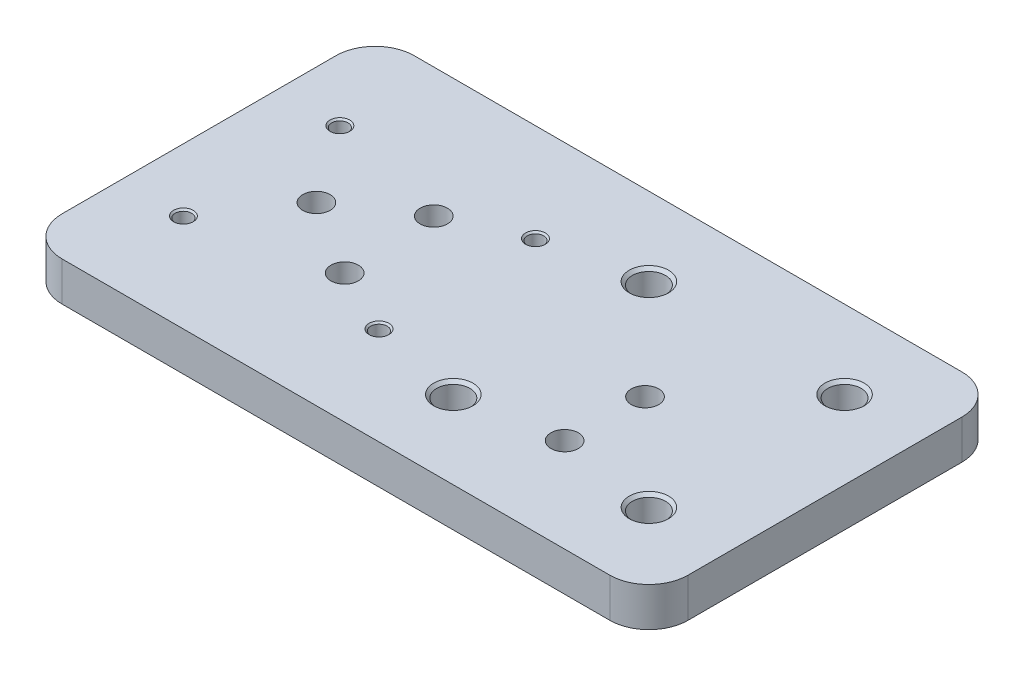
ISO-10303-21;
HEADER;
FILE_DESCRIPTION(('STEP AP214'),'2;1');
FILE_NAME('part.step','',(''),(''),'','','');
FILE_SCHEMA(('AUTOMOTIVE_DESIGN { 1 0 10303 214 1 1 1 1 }'));
ENDSEC;
DATA;
#1=APPLICATION_CONTEXT('core data for automotive mechanical design processes');
#2=APPLICATION_PROTOCOL_DEFINITION('international standard','automotive_design',2000,#1);
#3=PRODUCT_CONTEXT('',#1,'mechanical');
#4=PRODUCT('Part','Part','',(#3));
#5=PRODUCT_RELATED_PRODUCT_CATEGORY('part','',(#4));
#6=PRODUCT_DEFINITION_FORMATION('','',#4);
#7=PRODUCT_DEFINITION_CONTEXT('part definition',#1,'design');
#8=PRODUCT_DEFINITION('design','',#6,#7);
#9=PRODUCT_DEFINITION_SHAPE('','',#8);
#10=(LENGTH_UNIT() NAMED_UNIT(*) SI_UNIT(.MILLI.,.METRE.));
#11=(NAMED_UNIT(*) PLANE_ANGLE_UNIT() SI_UNIT($,.RADIAN.));
#12=(NAMED_UNIT(*) SI_UNIT($,.STERADIAN.) SOLID_ANGLE_UNIT());
#13=UNCERTAINTY_MEASURE_WITH_UNIT(LENGTH_MEASURE(1.E-05),#10,'distance_accuracy_value','');
#14=(GEOMETRIC_REPRESENTATION_CONTEXT(3) GLOBAL_UNCERTAINTY_ASSIGNED_CONTEXT((#13)) GLOBAL_UNIT_ASSIGNED_CONTEXT((#10,
#11,#12)) REPRESENTATION_CONTEXT('',''));
#15=CARTESIAN_POINT('',(0.,0.,0.));
#16=DIRECTION('',(0.,0.,1.));
#17=DIRECTION('',(1.,0.,0.));
#18=AXIS2_PLACEMENT_3D('',#15,#16,#17);
#19=CARTESIAN_POINT('',(150.,10.,10.));
#20=DIRECTION('',(0.,-1.,0.));
#21=DIRECTION('',(0.,0.,-1.));
#22=AXIS2_PLACEMENT_3D('',#19,#20,#21);
#23=PLANE('',#22);
#24=CARTESIAN_POINT('',(48.,10.,33.));
#25=DIRECTION('',(0.,-1.,0.));
#26=DIRECTION('',(0.,0.,-1.));
#27=AXIS2_PLACEMENT_3D('',#24,#25,#26);
#28=CIRCLE('',#27,3.5);
#29=CARTESIAN_POINT('',(48.,10.,29.5));
#30=VERTEX_POINT('',#29);
#31=EDGE_CURVE('E260',#30,#30,#28,.T.);
#32=ORIENTED_EDGE('',*,*,#31,.T.);
#33=EDGE_LOOP('',(#32));
#34=FACE_BOUND('',#33,.T.);
#35=CARTESIAN_POINT('',(30.,10.,45.));
#36=DIRECTION('',(0.,-1.,0.));
#37=DIRECTION('',(0.,0.,-1.));
#38=AXIS2_PLACEMENT_3D('',#35,#36,#37);
#39=CIRCLE('',#38,3.5);
#40=CARTESIAN_POINT('',(30.,10.,41.5));
#41=VERTEX_POINT('',#40);
#42=EDGE_CURVE('E263',#41,#41,#39,.T.);
#43=ORIENTED_EDGE('',*,*,#42,.T.);
#44=EDGE_LOOP('',(#43));
#45=FACE_BOUND('',#44,.T.);
#46=CARTESIAN_POINT('',(49.2273002760498,10.,57.));
#47=DIRECTION('',(0.,-1.,0.));
#48=DIRECTION('',(0.,0.,-1.));
#49=AXIS2_PLACEMENT_3D('',#46,#47,#48);
#50=CIRCLE('',#49,3.5);
#51=CARTESIAN_POINT('',(49.2273002760498,10.,53.5));
#52=VERTEX_POINT('',#51);
#53=EDGE_CURVE('E266',#52,#52,#50,.T.);
#54=ORIENTED_EDGE('',*,*,#53,.T.);
#55=EDGE_LOOP('',(#54));
#56=FACE_BOUND('',#55,.T.);
#57=CARTESIAN_POINT('',(114.452044256162,10.,66.));
#58=DIRECTION('',(0.,-1.,0.));
#59=DIRECTION('',(0.,0.,-1.));
#60=AXIS2_PLACEMENT_3D('',#57,#58,#59);
#61=CIRCLE('',#60,3.50000000000001);
#62=CARTESIAN_POINT('',(114.452044256162,10.,62.5));
#63=VERTEX_POINT('',#62);
#64=EDGE_CURVE('E269',#63,#63,#61,.T.);
#65=ORIENTED_EDGE('',*,*,#64,.T.);
#66=EDGE_LOOP('',(#65));
#67=FACE_BOUND('',#66,.T.);
#68=CARTESIAN_POINT('',(115.,10.,46.));
#69=DIRECTION('',(0.,-1.,0.));
#70=DIRECTION('',(0.,0.,-1.));
#71=AXIS2_PLACEMENT_3D('',#68,#69,#70);
#72=CIRCLE('',#71,3.50000000000001);
#73=CARTESIAN_POINT('',(115.,10.,42.5));
#74=VERTEX_POINT('',#73);
#75=EDGE_CURVE('E272',#74,#74,#72,.T.);
#76=ORIENTED_EDGE('',*,*,#75,.T.);
#77=EDGE_LOOP('',(#76));
#78=FACE_BOUND('',#77,.T.);
#79=CARTESIAN_POINT('',(140.,10.,20.));
#80=DIRECTION('',(0.,1.,0.));
#81=DIRECTION('',(0.,0.,1.));
#82=AXIS2_PLACEMENT_3D('',#79,#80,#81);
#83=CIRCLE('',#82,5.025);
#84=CARTESIAN_POINT('',(140.,10.,25.025));
#85=VERTEX_POINT('',#84);
#86=EDGE_CURVE('E248',#85,#85,#83,.T.);
#87=ORIENTED_EDGE('',*,*,#86,.F.);
#88=EDGE_LOOP('',(#87));
#89=FACE_BOUND('',#88,.T.);
#90=CARTESIAN_POINT('',(140.,10.,70.));
#91=DIRECTION('',(0.,1.,0.));
#92=DIRECTION('',(0.,0.,1.));
#93=AXIS2_PLACEMENT_3D('',#90,#91,#92);
#94=CIRCLE('',#93,5.025);
#95=CARTESIAN_POINT('',(140.,10.,75.025));
#96=VERTEX_POINT('',#95);
#97=EDGE_CURVE('E239',#96,#96,#94,.T.);
#98=ORIENTED_EDGE('',*,*,#97,.F.);
#99=EDGE_LOOP('',(#98));
#100=FACE_BOUND('',#99,.T.);
#101=CARTESIAN_POINT('',(16.,10.,25.));
#102=DIRECTION('',(0.,1.,0.));
#103=DIRECTION('',(0.,0.,1.));
#104=AXIS2_PLACEMENT_3D('',#101,#102,#103);
#105=CIRCLE('',#104,2.525);
#106=CARTESIAN_POINT('',(16.,10.,27.525));
#107=VERTEX_POINT('',#106);
#108=EDGE_CURVE('E221',#107,#107,#105,.T.);
#109=ORIENTED_EDGE('',*,*,#108,.F.);
#110=EDGE_LOOP('',(#109));
#111=FACE_BOUND('',#110,.T.);
#112=CARTESIAN_POINT('',(16.,10.,65.));
#113=DIRECTION('',(0.,1.,0.));
#114=DIRECTION('',(0.,0.,1.));
#115=AXIS2_PLACEMENT_3D('',#112,#113,#114);
#116=CIRCLE('',#115,2.525);
#117=CARTESIAN_POINT('',(16.,10.,67.525));
#118=VERTEX_POINT('',#117);
#119=EDGE_CURVE('E212',#118,#118,#116,.T.);
#120=ORIENTED_EDGE('',*,*,#119,.F.);
#121=EDGE_LOOP('',(#120));
#122=FACE_BOUND('',#121,.T.);
#123=CARTESIAN_POINT('',(66.,10.,65.));
#124=DIRECTION('',(0.,1.,0.));
#125=DIRECTION('',(0.,0.,1.));
#126=AXIS2_PLACEMENT_3D('',#123,#124,#125);
#127=CIRCLE('',#126,2.525);
#128=CARTESIAN_POINT('',(66.,10.,67.525));
#129=VERTEX_POINT('',#128);
#130=EDGE_CURVE('E194',#129,#129,#127,.T.);
#131=ORIENTED_EDGE('',*,*,#130,.F.);
#132=EDGE_LOOP('',(#131));
#133=FACE_BOUND('',#132,.T.);
#134=CARTESIAN_POINT('',(150.,10.,10.));
#135=DIRECTION('',(0.,1.,0.));
#136=DIRECTION('',(0.,0.,-1.));
#137=AXIS2_PLACEMENT_3D('',#134,#135,#136);
#138=CIRCLE('',#137,10.);
#139=CARTESIAN_POINT('',(160.,10.,10.0000000000001));
#140=VERTEX_POINT('',#139);
#141=CARTESIAN_POINT('',(150.,10.,0.));
#142=VERTEX_POINT('',#141);
#143=EDGE_CURVE('E155',#140,#142,#138,.T.);
#144=ORIENTED_EDGE('',*,*,#143,.T.);
#145=DIRECTION('',(-1.,0.,0.));
#146=VECTOR('',#145,1.);
#147=CARTESIAN_POINT('',(10.0000000000001,10.,0.));
#148=LINE('',#147,#146);
#149=CARTESIAN_POINT('',(10.0000000000001,10.,0.));
#150=VERTEX_POINT('',#149);
#151=EDGE_CURVE('E103',#142,#150,#148,.T.);
#152=ORIENTED_EDGE('',*,*,#151,.T.);
#153=CARTESIAN_POINT('',(10.,10.,10.));
#154=DIRECTION('',(0.,1.,0.));
#155=DIRECTION('',(0.,0.,1.));
#156=AXIS2_PLACEMENT_3D('',#153,#154,#155);
#157=CIRCLE('',#156,10.);
#158=CARTESIAN_POINT('',(0.,10.,10.0000000000001));
#159=VERTEX_POINT('',#158);
#160=EDGE_CURVE('E170',#150,#159,#157,.T.);
#161=ORIENTED_EDGE('',*,*,#160,.T.);
#162=DIRECTION('',(0.,0.,1.));
#163=VECTOR('',#162,1.);
#164=CARTESIAN_POINT('',(0.,10.,10.0000000000001));
#165=LINE('',#164,#163);
#166=CARTESIAN_POINT('',(0.,10.,79.9999999999999));
#167=VERTEX_POINT('',#166);
#168=EDGE_CURVE('E183',#159,#167,#165,.T.);
#169=ORIENTED_EDGE('',*,*,#168,.T.);
#170=CARTESIAN_POINT('',(10.,10.,80.));
#171=DIRECTION('',(0.,1.,0.));
#172=DIRECTION('',(0.,0.,1.));
#173=AXIS2_PLACEMENT_3D('',#170,#171,#172);
#174=CIRCLE('',#173,10.);
#175=CARTESIAN_POINT('',(10.,10.,90.));
#176=VERTEX_POINT('',#175);
#177=EDGE_CURVE('E122',#167,#176,#174,.T.);
#178=ORIENTED_EDGE('',*,*,#177,.T.);
#179=DIRECTION('',(1.,0.,0.));
#180=VECTOR('',#179,1.);
#181=CARTESIAN_POINT('',(10.0000000000001,10.,90.));
#182=LINE('',#181,#180);
#183=CARTESIAN_POINT('',(150.,10.,90.));
#184=VERTEX_POINT('',#183);
#185=EDGE_CURVE('E116',#176,#184,#182,.T.);
#186=ORIENTED_EDGE('',*,*,#185,.T.);
#187=CARTESIAN_POINT('',(150.,10.,80.));
#188=DIRECTION('',(0.,1.,0.));
#189=DIRECTION('',(0.,0.,1.));
#190=AXIS2_PLACEMENT_3D('',#187,#188,#189);
#191=CIRCLE('',#190,10.);
#192=CARTESIAN_POINT('',(160.,10.,79.9999999999999));
#193=VERTEX_POINT('',#192);
#194=EDGE_CURVE('E120',#184,#193,#191,.T.);
#195=ORIENTED_EDGE('',*,*,#194,.T.);
#196=DIRECTION('',(0.,0.,-1.));
#197=VECTOR('',#196,1.);
#198=CARTESIAN_POINT('',(160.,10.,10.0000000000001));
#199=LINE('',#198,#197);
#200=EDGE_CURVE('E60',#193,#140,#199,.T.);
#201=ORIENTED_EDGE('',*,*,#200,.T.);
#202=EDGE_LOOP('',(#144,#152,#161,#169,#178,#186,#195,#201));
#203=FACE_BOUND('',#202,.T.);
#204=CARTESIAN_POINT('',(66.,10.,25.));
#205=DIRECTION('',(0.,1.,0.));
#206=DIRECTION('',(0.,0.,1.));
#207=AXIS2_PLACEMENT_3D('',#204,#205,#206);
#208=CIRCLE('',#207,2.525);
#209=CARTESIAN_POINT('',(66.,10.,27.525));
#210=VERTEX_POINT('',#209);
#211=EDGE_CURVE('E203',#210,#210,#208,.T.);
#212=ORIENTED_EDGE('',*,*,#211,.F.);
#213=EDGE_LOOP('',(#212));
#214=FACE_BOUND('',#213,.T.);
#215=CARTESIAN_POINT('',(90.,10.,70.));
#216=DIRECTION('',(0.,1.,0.));
#217=DIRECTION('',(0.,0.,1.));
#218=AXIS2_PLACEMENT_3D('',#215,#216,#217);
#219=CIRCLE('',#218,5.025);
#220=CARTESIAN_POINT('',(90.,10.,75.025));
#221=VERTEX_POINT('',#220);
#222=EDGE_CURVE('E230',#221,#221,#219,.T.);
#223=ORIENTED_EDGE('',*,*,#222,.F.);
#224=EDGE_LOOP('',(#223));
#225=FACE_BOUND('',#224,.T.);
#226=CARTESIAN_POINT('',(90.,10.,20.));
#227=DIRECTION('',(0.,1.,0.));
#228=DIRECTION('',(0.,0.,1.));
#229=AXIS2_PLACEMENT_3D('',#226,#227,#228);
#230=CIRCLE('',#229,5.025);
#231=CARTESIAN_POINT('',(90.,10.,25.025));
#232=VERTEX_POINT('',#231);
#233=EDGE_CURVE('E257',#232,#232,#230,.T.);
#234=ORIENTED_EDGE('',*,*,#233,.F.);
#235=EDGE_LOOP('',(#234));
#236=FACE_BOUND('',#235,.T.);
#237=ADVANCED_FACE('F43',(#34,#45,#56,#67,#78,#89,#100,#111,#122,#133,#203,#214,#225,#236),#23,.F.);
#238=CARTESIAN_POINT('',(150.,0.,10.));
#239=DIRECTION('',(0.,-1.,0.));
#240=DIRECTION('',(0.,0.,-1.));
#241=AXIS2_PLACEMENT_3D('',#238,#239,#240);
#242=PLANE('',#241);
#243=CARTESIAN_POINT('',(48.,0.,33.));
#244=DIRECTION('',(0.,1.,0.));
#245=DIRECTION('',(0.,0.,1.));
#246=AXIS2_PLACEMENT_3D('',#243,#244,#245);
#247=CIRCLE('',#246,3.5);
#248=CARTESIAN_POINT('',(48.,0.,36.5));
#249=VERTEX_POINT('',#248);
#250=EDGE_CURVE('E275',#249,#249,#247,.T.);
#251=ORIENTED_EDGE('',*,*,#250,.T.);
#252=EDGE_LOOP('',(#251));
#253=FACE_BOUND('',#252,.T.);
#254=CARTESIAN_POINT('',(30.,0.,45.));
#255=DIRECTION('',(0.,1.,0.));
#256=DIRECTION('',(0.,0.,1.));
#257=AXIS2_PLACEMENT_3D('',#254,#255,#256);
#258=CIRCLE('',#257,3.5);
#259=CARTESIAN_POINT('',(30.,0.,48.5));
#260=VERTEX_POINT('',#259);
#261=EDGE_CURVE('E285',#260,#260,#258,.T.);
#262=ORIENTED_EDGE('',*,*,#261,.T.);
#263=EDGE_LOOP('',(#262));
#264=FACE_BOUND('',#263,.T.);
#265=CARTESIAN_POINT('',(49.2273002760498,0.,57.));
#266=DIRECTION('',(0.,1.,0.));
#267=DIRECTION('',(0.,0.,1.));
#268=AXIS2_PLACEMENT_3D('',#265,#266,#267);
#269=CIRCLE('',#268,3.5);
#270=CARTESIAN_POINT('',(49.2273002760498,0.,60.5));
#271=VERTEX_POINT('',#270);
#272=EDGE_CURVE('E282',#271,#271,#269,.T.);
#273=ORIENTED_EDGE('',*,*,#272,.T.);
#274=EDGE_LOOP('',(#273));
#275=FACE_BOUND('',#274,.T.);
#276=CARTESIAN_POINT('',(114.452044256162,0.,66.));
#277=DIRECTION('',(0.,1.,0.));
#278=DIRECTION('',(0.,0.,1.));
#279=AXIS2_PLACEMENT_3D('',#276,#277,#278);
#280=CIRCLE('',#279,3.50000000000001);
#281=CARTESIAN_POINT('',(114.452044256162,0.,69.5));
#282=VERTEX_POINT('',#281);
#283=EDGE_CURVE('E279',#282,#282,#280,.T.);
#284=ORIENTED_EDGE('',*,*,#283,.T.);
#285=EDGE_LOOP('',(#284));
#286=FACE_BOUND('',#285,.T.);
#287=CARTESIAN_POINT('',(115.,0.,46.));
#288=DIRECTION('',(0.,1.,0.));
#289=DIRECTION('',(0.,0.,1.));
#290=AXIS2_PLACEMENT_3D('',#287,#288,#289);
#291=CIRCLE('',#290,3.50000000000001);
#292=CARTESIAN_POINT('',(115.,0.,49.5));
#293=VERTEX_POINT('',#292);
#294=EDGE_CURVE('E276',#293,#293,#291,.T.);
#295=ORIENTED_EDGE('',*,*,#294,.T.);
#296=EDGE_LOOP('',(#295));
#297=FACE_BOUND('',#296,.T.);
#298=CARTESIAN_POINT('',(150.,0.,10.));
#299=DIRECTION('',(0.,1.,0.));
#300=DIRECTION('',(0.,0.,-1.));
#301=AXIS2_PLACEMENT_3D('',#298,#299,#300);
#302=CIRCLE('',#301,10.);
#303=CARTESIAN_POINT('',(160.,0.,10.0000000000001));
#304=VERTEX_POINT('',#303);
#305=CARTESIAN_POINT('',(150.,0.,0.));
#306=VERTEX_POINT('',#305);
#307=EDGE_CURVE('E140',#304,#306,#302,.T.);
#308=ORIENTED_EDGE('',*,*,#307,.F.);
#309=DIRECTION('',(0.,0.,-1.));
#310=VECTOR('',#309,1.);
#311=CARTESIAN_POINT('',(160.,0.,10.0000000000001));
#312=LINE('',#311,#310);
#313=CARTESIAN_POINT('',(160.,0.,79.9999999999999));
#314=VERTEX_POINT('',#313);
#315=EDGE_CURVE('E95',#314,#304,#312,.T.);
#316=ORIENTED_EDGE('',*,*,#315,.F.);
#317=CARTESIAN_POINT('',(150.,0.,80.));
#318=DIRECTION('',(0.,1.,0.));
#319=DIRECTION('',(0.,0.,1.));
#320=AXIS2_PLACEMENT_3D('',#317,#318,#319);
#321=CIRCLE('',#320,10.);
#322=CARTESIAN_POINT('',(150.,0.,90.));
#323=VERTEX_POINT('',#322);
#324=EDGE_CURVE('E89',#323,#314,#321,.T.);
#325=ORIENTED_EDGE('',*,*,#324,.F.);
#326=DIRECTION('',(1.,0.,0.));
#327=VECTOR('',#326,1.);
#328=CARTESIAN_POINT('',(10.0000000000001,0.,90.));
#329=LINE('',#328,#327);
#330=CARTESIAN_POINT('',(10.,0.,90.));
#331=VERTEX_POINT('',#330);
#332=EDGE_CURVE('E130',#331,#323,#329,.T.);
#333=ORIENTED_EDGE('',*,*,#332,.F.);
#334=CARTESIAN_POINT('',(10.,0.,80.));
#335=DIRECTION('',(0.,1.,0.));
#336=DIRECTION('',(0.,0.,1.));
#337=AXIS2_PLACEMENT_3D('',#334,#335,#336);
#338=CIRCLE('',#337,10.);
#339=CARTESIAN_POINT('',(0.,0.,79.9999999999999));
#340=VERTEX_POINT('',#339);
#341=EDGE_CURVE('E150',#340,#331,#338,.T.);
#342=ORIENTED_EDGE('',*,*,#341,.F.);
#343=DIRECTION('',(0.,0.,1.));
#344=VECTOR('',#343,1.);
#345=CARTESIAN_POINT('',(0.,0.,10.0000000000001));
#346=LINE('',#345,#344);
#347=CARTESIAN_POINT('',(0.,0.,10.0000000000001));
#348=VERTEX_POINT('',#347);
#349=EDGE_CURVE('E148',#348,#340,#346,.T.);
#350=ORIENTED_EDGE('',*,*,#349,.F.);
#351=CARTESIAN_POINT('',(10.,0.,10.));
#352=DIRECTION('',(0.,1.,0.));
#353=DIRECTION('',(0.,0.,1.));
#354=AXIS2_PLACEMENT_3D('',#351,#352,#353);
#355=CIRCLE('',#354,10.);
#356=CARTESIAN_POINT('',(10.0000000000001,0.,0.));
#357=VERTEX_POINT('',#356);
#358=EDGE_CURVE('E146',#357,#348,#355,.T.);
#359=ORIENTED_EDGE('',*,*,#358,.F.);
#360=DIRECTION('',(-1.,0.,0.));
#361=VECTOR('',#360,1.);
#362=CARTESIAN_POINT('',(10.0000000000001,0.,0.));
#363=LINE('',#362,#361);
#364=EDGE_CURVE('E143',#306,#357,#363,.T.);
#365=ORIENTED_EDGE('',*,*,#364,.F.);
#366=EDGE_LOOP('',(#308,#316,#325,#333,#342,#350,#359,#365));
#367=FACE_BOUND('',#366,.T.);
#368=CARTESIAN_POINT('',(66.,0.,65.));
#369=DIRECTION('',(0.,1.,0.));
#370=DIRECTION('',(0.,0.,1.));
#371=AXIS2_PLACEMENT_3D('',#368,#369,#370);
#372=CIRCLE('',#371,2.1);
#373=CARTESIAN_POINT('',(66.,0.,67.1));
#374=VERTEX_POINT('',#373);
#375=EDGE_CURVE('E144',#374,#374,#372,.T.);
#376=ORIENTED_EDGE('',*,*,#375,.T.);
#377=EDGE_LOOP('',(#376));
#378=FACE_BOUND('',#377,.T.);
#379=CARTESIAN_POINT('',(66.,0.,25.));
#380=DIRECTION('',(0.,1.,0.));
#381=DIRECTION('',(0.,0.,1.));
#382=AXIS2_PLACEMENT_3D('',#379,#380,#381);
#383=CIRCLE('',#382,2.1);
#384=CARTESIAN_POINT('',(66.,0.,27.1));
#385=VERTEX_POINT('',#384);
#386=EDGE_CURVE('E197',#385,#385,#383,.T.);
#387=ORIENTED_EDGE('',*,*,#386,.T.);
#388=EDGE_LOOP('',(#387));
#389=FACE_BOUND('',#388,.T.);
#390=CARTESIAN_POINT('',(16.,0.,65.));
#391=DIRECTION('',(0.,1.,0.));
#392=DIRECTION('',(0.,0.,1.));
#393=AXIS2_PLACEMENT_3D('',#390,#391,#392);
#394=CIRCLE('',#393,2.1);
#395=CARTESIAN_POINT('',(16.,0.,67.1));
#396=VERTEX_POINT('',#395);
#397=EDGE_CURVE('E206',#396,#396,#394,.T.);
#398=ORIENTED_EDGE('',*,*,#397,.T.);
#399=EDGE_LOOP('',(#398));
#400=FACE_BOUND('',#399,.T.);
#401=CARTESIAN_POINT('',(16.,0.,25.));
#402=DIRECTION('',(0.,1.,0.));
#403=DIRECTION('',(0.,0.,1.));
#404=AXIS2_PLACEMENT_3D('',#401,#402,#403);
#405=CIRCLE('',#404,2.1);
#406=CARTESIAN_POINT('',(16.,0.,27.1));
#407=VERTEX_POINT('',#406);
#408=EDGE_CURVE('E215',#407,#407,#405,.T.);
#409=ORIENTED_EDGE('',*,*,#408,.T.);
#410=EDGE_LOOP('',(#409));
#411=FACE_BOUND('',#410,.T.);
#412=CARTESIAN_POINT('',(90.,0.,70.));
#413=DIRECTION('',(0.,1.,0.));
#414=DIRECTION('',(0.,0.,1.));
#415=AXIS2_PLACEMENT_3D('',#412,#413,#414);
#416=CIRCLE('',#415,4.25);
#417=CARTESIAN_POINT('',(90.,0.,74.25));
#418=VERTEX_POINT('',#417);
#419=EDGE_CURVE('E224',#418,#418,#416,.T.);
#420=ORIENTED_EDGE('',*,*,#419,.T.);
#421=EDGE_LOOP('',(#420));
#422=FACE_BOUND('',#421,.T.);
#423=CARTESIAN_POINT('',(140.,0.,70.));
#424=DIRECTION('',(0.,1.,0.));
#425=DIRECTION('',(0.,0.,1.));
#426=AXIS2_PLACEMENT_3D('',#423,#424,#425);
#427=CIRCLE('',#426,4.25);
#428=CARTESIAN_POINT('',(140.,0.,74.25));
#429=VERTEX_POINT('',#428);
#430=EDGE_CURVE('E233',#429,#429,#427,.T.);
#431=ORIENTED_EDGE('',*,*,#430,.T.);
#432=EDGE_LOOP('',(#431));
#433=FACE_BOUND('',#432,.T.);
#434=CARTESIAN_POINT('',(140.,0.,20.));
#435=DIRECTION('',(0.,1.,0.));
#436=DIRECTION('',(0.,0.,1.));
#437=AXIS2_PLACEMENT_3D('',#434,#435,#436);
#438=CIRCLE('',#437,4.25);
#439=CARTESIAN_POINT('',(140.,0.,24.25));
#440=VERTEX_POINT('',#439);
#441=EDGE_CURVE('E242',#440,#440,#438,.T.);
#442=ORIENTED_EDGE('',*,*,#441,.T.);
#443=EDGE_LOOP('',(#442));
#444=FACE_BOUND('',#443,.T.);
#445=CARTESIAN_POINT('',(90.,0.,20.));
#446=DIRECTION('',(0.,1.,0.));
#447=DIRECTION('',(0.,0.,1.));
#448=AXIS2_PLACEMENT_3D('',#445,#446,#447);
#449=CIRCLE('',#448,4.25);
#450=CARTESIAN_POINT('',(90.,0.,24.25));
#451=VERTEX_POINT('',#450);
#452=EDGE_CURVE('E251',#451,#451,#449,.T.);
#453=ORIENTED_EDGE('',*,*,#452,.T.);
#454=EDGE_LOOP('',(#453));
#455=FACE_BOUND('',#454,.T.);
#456=ADVANCED_FACE('F174',(#253,#264,#275,#286,#297,#367,#378,#389,#400,#411,#422,#433,#444,
#455),#242,.T.);
#457=CARTESIAN_POINT('',(150.,10.,10.));
#458=DIRECTION('',(0.,-1.,0.));
#459=DIRECTION('',(0.,0.,-1.));
#460=AXIS2_PLACEMENT_3D('',#457,#458,#459);
#461=CYLINDRICAL_SURFACE('',#460,10.);
#462=ORIENTED_EDGE('',*,*,#307,.T.);
#463=DIRECTION('',(0.,-1.,0.));
#464=VECTOR('',#463,1.);
#465=CARTESIAN_POINT('',(150.,10.,0.));
#466=LINE('',#465,#464);
#467=EDGE_CURVE('E11',#142,#306,#466,.T.);
#468=ORIENTED_EDGE('',*,*,#467,.F.);
#469=ORIENTED_EDGE('',*,*,#143,.F.);
#470=DIRECTION('',(0.,-1.,0.));
#471=VECTOR('',#470,1.);
#472=CARTESIAN_POINT('',(160.,10.,10.0000000000001));
#473=LINE('',#472,#471);
#474=EDGE_CURVE('E136',#140,#304,#473,.T.);
#475=ORIENTED_EDGE('',*,*,#474,.T.);
#476=EDGE_LOOP('',(#462,#468,#469,#475));
#477=FACE_BOUND('',#476,.T.);
#478=ADVANCED_FACE('F45',(#477),#461,.T.);
#479=CARTESIAN_POINT('',(10.0000000000001,10.,0.));
#480=DIRECTION('',(0.,0.,1.));
#481=DIRECTION('',(1.,0.,0.));
#482=AXIS2_PLACEMENT_3D('',#479,#480,#481);
#483=PLANE('',#482);
#484=ORIENTED_EDGE('',*,*,#364,.T.);
#485=DIRECTION('',(0.,-1.,0.));
#486=VECTOR('',#485,1.);
#487=CARTESIAN_POINT('',(10.0000000000001,10.,0.));
#488=LINE('',#487,#486);
#489=EDGE_CURVE('E52',#150,#357,#488,.T.);
#490=ORIENTED_EDGE('',*,*,#489,.F.);
#491=ORIENTED_EDGE('',*,*,#151,.F.);
#492=ORIENTED_EDGE('',*,*,#467,.T.);
#493=EDGE_LOOP('',(#484,#490,#491,#492));
#494=FACE_BOUND('',#493,.T.);
#495=ADVANCED_FACE('F355',(#494),#483,.F.);
#496=CARTESIAN_POINT('',(10.,10.,10.));
#497=DIRECTION('',(0.,-1.,0.));
#498=DIRECTION('',(0.,0.,-1.));
#499=AXIS2_PLACEMENT_3D('',#496,#497,#498);
#500=CYLINDRICAL_SURFACE('',#499,10.);
#501=ORIENTED_EDGE('',*,*,#358,.T.);
#502=DIRECTION('',(0.,-1.,0.));
#503=VECTOR('',#502,1.);
#504=CARTESIAN_POINT('',(0.,10.,10.0000000000001));
#505=LINE('',#504,#503);
#506=EDGE_CURVE('E162',#159,#348,#505,.T.);
#507=ORIENTED_EDGE('',*,*,#506,.F.);
#508=ORIENTED_EDGE('',*,*,#160,.F.);
#509=ORIENTED_EDGE('',*,*,#489,.T.);
#510=EDGE_LOOP('',(#501,#507,#508,#509));
#511=FACE_BOUND('',#510,.T.);
#512=ADVANCED_FACE('F168',(#511),#500,.T.);
#513=CARTESIAN_POINT('',(0.,10.,10.0000000000001));
#514=DIRECTION('',(1.,0.,0.));
#515=DIRECTION('',(0.,0.,-1.));
#516=AXIS2_PLACEMENT_3D('',#513,#514,#515);
#517=PLANE('',#516);
#518=ORIENTED_EDGE('',*,*,#349,.T.);
#519=DIRECTION('',(0.,-1.,0.));
#520=VECTOR('',#519,1.);
#521=CARTESIAN_POINT('',(0.,10.,79.9999999999999));
#522=LINE('',#521,#520);
#523=EDGE_CURVE('E159',#167,#340,#522,.T.);
#524=ORIENTED_EDGE('',*,*,#523,.F.);
#525=ORIENTED_EDGE('',*,*,#168,.F.);
#526=ORIENTED_EDGE('',*,*,#506,.T.);
#527=EDGE_LOOP('',(#518,#524,#525,#526));
#528=FACE_BOUND('',#527,.T.);
#529=ADVANCED_FACE('F179',(#528),#517,.F.);
#530=CARTESIAN_POINT('',(10.,10.,80.));
#531=DIRECTION('',(0.,-1.,0.));
#532=DIRECTION('',(0.,0.,-1.));
#533=AXIS2_PLACEMENT_3D('',#530,#531,#532);
#534=CYLINDRICAL_SURFACE('',#533,10.);
#535=ORIENTED_EDGE('',*,*,#341,.T.);
#536=DIRECTION('',(0.,-1.,0.));
#537=VECTOR('',#536,1.);
#538=CARTESIAN_POINT('',(10.,10.,90.));
#539=LINE('',#538,#537);
#540=EDGE_CURVE('E131',#176,#331,#539,.T.);
#541=ORIENTED_EDGE('',*,*,#540,.F.);
#542=ORIENTED_EDGE('',*,*,#177,.F.);
#543=ORIENTED_EDGE('',*,*,#523,.T.);
#544=EDGE_LOOP('',(#535,#541,#542,#543));
#545=FACE_BOUND('',#544,.T.);
#546=ADVANCED_FACE('F182',(#545),#534,.T.);
#547=CARTESIAN_POINT('',(10.0000000000001,10.,90.));
#548=DIRECTION('',(0.,0.,-1.));
#549=DIRECTION('',(-1.,0.,0.));
#550=AXIS2_PLACEMENT_3D('',#547,#548,#549);
#551=PLANE('',#550);
#552=ORIENTED_EDGE('',*,*,#332,.T.);
#553=DIRECTION('',(0.,-1.,0.));
#554=VECTOR('',#553,1.);
#555=CARTESIAN_POINT('',(150.,10.,90.));
#556=LINE('',#555,#554);
#557=EDGE_CURVE('E127',#184,#323,#556,.T.);
#558=ORIENTED_EDGE('',*,*,#557,.F.);
#559=ORIENTED_EDGE('',*,*,#185,.F.);
#560=ORIENTED_EDGE('',*,*,#540,.T.);
#561=EDGE_LOOP('',(#552,#558,#559,#560));
#562=FACE_BOUND('',#561,.T.);
#563=ADVANCED_FACE('F128',(#562),#551,.F.);
#564=CARTESIAN_POINT('',(150.,10.,80.));
#565=DIRECTION('',(0.,-1.,0.));
#566=DIRECTION('',(0.,0.,-1.));
#567=AXIS2_PLACEMENT_3D('',#564,#565,#566);
#568=CYLINDRICAL_SURFACE('',#567,10.);
#569=ORIENTED_EDGE('',*,*,#324,.T.);
#570=DIRECTION('',(0.,-1.,0.));
#571=VECTOR('',#570,1.);
#572=CARTESIAN_POINT('',(160.,10.,79.9999999999999));
#573=LINE('',#572,#571);
#574=EDGE_CURVE('E132',#193,#314,#573,.T.);
#575=ORIENTED_EDGE('',*,*,#574,.F.);
#576=ORIENTED_EDGE('',*,*,#194,.F.);
#577=ORIENTED_EDGE('',*,*,#557,.T.);
#578=EDGE_LOOP('',(#569,#575,#576,#577));
#579=FACE_BOUND('',#578,.T.);
#580=ADVANCED_FACE('F134',(#579),#568,.T.);
#581=CARTESIAN_POINT('',(160.,10.,10.0000000000001));
#582=DIRECTION('',(-1.,0.,0.));
#583=DIRECTION('',(0.,0.,1.));
#584=AXIS2_PLACEMENT_3D('',#581,#582,#583);
#585=PLANE('',#584);
#586=ORIENTED_EDGE('',*,*,#315,.T.);
#587=ORIENTED_EDGE('',*,*,#474,.F.);
#588=ORIENTED_EDGE('',*,*,#200,.F.);
#589=ORIENTED_EDGE('',*,*,#574,.T.);
#590=EDGE_LOOP('',(#586,#587,#588,#589));
#591=FACE_BOUND('',#590,.T.);
#592=ADVANCED_FACE('F336',(#591),#585,.F.);
#593=CARTESIAN_POINT('',(66.,10.,65.));
#594=DIRECTION('',(0.,1.,0.));
#595=DIRECTION('',(0.,0.,1.));
#596=AXIS2_PLACEMENT_3D('',#593,#594,#595);
#597=CYLINDRICAL_SURFACE('',#596,2.1);
#598=ORIENTED_EDGE('',*,*,#375,.F.);
#599=EDGE_LOOP('',(#598));
#600=FACE_BOUND('',#599,.T.);
#601=CARTESIAN_POINT('',(66.,9.575,65.));
#602=DIRECTION('',(0.,1.,0.));
#603=DIRECTION('',(0.,0.,1.));
#604=AXIS2_PLACEMENT_3D('',#601,#602,#603);
#605=CIRCLE('',#604,2.1);
#606=CARTESIAN_POINT('',(66.,9.575,67.1));
#607=VERTEX_POINT('',#606);
#608=EDGE_CURVE('E191',#607,#607,#605,.T.);
#609=ORIENTED_EDGE('',*,*,#608,.T.);
#610=EDGE_LOOP('',(#609));
#611=FACE_BOUND('',#610,.T.);
#612=ADVANCED_FACE('F324',(#600,#611),#597,.F.);
#613=CARTESIAN_POINT('',(66.,10.,65.));
#614=DIRECTION('',(0.,1.,0.));
#615=DIRECTION('',(0.,0.,1.));
#616=AXIS2_PLACEMENT_3D('',#613,#614,#615);
#617=CONICAL_SURFACE('',#616,2.525,0.78539816339744);
#618=ORIENTED_EDGE('',*,*,#608,.F.);
#619=EDGE_LOOP('',(#618));
#620=FACE_BOUND('',#619,.T.);
#621=ORIENTED_EDGE('',*,*,#130,.T.);
#622=EDGE_LOOP('',(#621));
#623=FACE_BOUND('',#622,.T.);
#624=ADVANCED_FACE('F321',(#620,#623),#617,.F.);
#625=CARTESIAN_POINT('',(66.,10.,25.));
#626=DIRECTION('',(0.,1.,0.));
#627=DIRECTION('',(0.,0.,1.));
#628=AXIS2_PLACEMENT_3D('',#625,#626,#627);
#629=CYLINDRICAL_SURFACE('',#628,2.1);
#630=ORIENTED_EDGE('',*,*,#386,.F.);
#631=EDGE_LOOP('',(#630));
#632=FACE_BOUND('',#631,.T.);
#633=CARTESIAN_POINT('',(66.,9.575,25.));
#634=DIRECTION('',(0.,1.,0.));
#635=DIRECTION('',(0.,0.,1.));
#636=AXIS2_PLACEMENT_3D('',#633,#634,#635);
#637=CIRCLE('',#636,2.1);
#638=CARTESIAN_POINT('',(66.,9.575,27.1));
#639=VERTEX_POINT('',#638);
#640=EDGE_CURVE('E200',#639,#639,#637,.T.);
#641=ORIENTED_EDGE('',*,*,#640,.T.);
#642=EDGE_LOOP('',(#641));
#643=FACE_BOUND('',#642,.T.);
#644=ADVANCED_FACE('F323',(#632,#643),#629,.F.);
#645=CARTESIAN_POINT('',(66.,10.,25.));
#646=DIRECTION('',(0.,1.,0.));
#647=DIRECTION('',(0.,0.,1.));
#648=AXIS2_PLACEMENT_3D('',#645,#646,#647);
#649=CONICAL_SURFACE('',#648,2.525,0.78539816339744);
#650=ORIENTED_EDGE('',*,*,#640,.F.);
#651=EDGE_LOOP('',(#650));
#652=FACE_BOUND('',#651,.T.);
#653=ORIENTED_EDGE('',*,*,#211,.T.);
#654=EDGE_LOOP('',(#653));
#655=FACE_BOUND('',#654,.T.);
#656=ADVANCED_FACE('F332',(#652,#655),#649,.F.);
#657=CARTESIAN_POINT('',(16.,10.,65.));
#658=DIRECTION('',(0.,1.,0.));
#659=DIRECTION('',(0.,0.,1.));
#660=AXIS2_PLACEMENT_3D('',#657,#658,#659);
#661=CYLINDRICAL_SURFACE('',#660,2.1);
#662=ORIENTED_EDGE('',*,*,#397,.F.);
#663=EDGE_LOOP('',(#662));
#664=FACE_BOUND('',#663,.T.);
#665=CARTESIAN_POINT('',(16.,9.575,65.));
#666=DIRECTION('',(0.,1.,0.));
#667=DIRECTION('',(0.,0.,1.));
#668=AXIS2_PLACEMENT_3D('',#665,#666,#667);
#669=CIRCLE('',#668,2.1);
#670=CARTESIAN_POINT('',(16.,9.575,67.1));
#671=VERTEX_POINT('',#670);
#672=EDGE_CURVE('E209',#671,#671,#669,.T.);
#673=ORIENTED_EDGE('',*,*,#672,.T.);
#674=EDGE_LOOP('',(#673));
#675=FACE_BOUND('',#674,.T.);
#676=ADVANCED_FACE('F431',(#664,#675),#661,.F.);
#677=CARTESIAN_POINT('',(16.,10.,65.));
#678=DIRECTION('',(0.,1.,0.));
#679=DIRECTION('',(0.,0.,1.));
#680=AXIS2_PLACEMENT_3D('',#677,#678,#679);
#681=CONICAL_SURFACE('',#680,2.525,0.785398163397448);
#682=ORIENTED_EDGE('',*,*,#672,.F.);
#683=EDGE_LOOP('',(#682));
#684=FACE_BOUND('',#683,.T.);
#685=ORIENTED_EDGE('',*,*,#119,.T.);
#686=EDGE_LOOP('',(#685));
#687=FACE_BOUND('',#686,.T.);
#688=ADVANCED_FACE('F441',(#684,#687),#681,.F.);
#689=CARTESIAN_POINT('',(16.,10.,25.));
#690=DIRECTION('',(0.,1.,0.));
#691=DIRECTION('',(0.,0.,1.));
#692=AXIS2_PLACEMENT_3D('',#689,#690,#691);
#693=CYLINDRICAL_SURFACE('',#692,2.1);
#694=ORIENTED_EDGE('',*,*,#408,.F.);
#695=EDGE_LOOP('',(#694));
#696=FACE_BOUND('',#695,.T.);
#697=CARTESIAN_POINT('',(16.,9.575,25.));
#698=DIRECTION('',(0.,1.,0.));
#699=DIRECTION('',(0.,0.,1.));
#700=AXIS2_PLACEMENT_3D('',#697,#698,#699);
#701=CIRCLE('',#700,2.1);
#702=CARTESIAN_POINT('',(16.,9.575,27.1));
#703=VERTEX_POINT('',#702);
#704=EDGE_CURVE('E218',#703,#703,#701,.T.);
#705=ORIENTED_EDGE('',*,*,#704,.T.);
#706=EDGE_LOOP('',(#705));
#707=FACE_BOUND('',#706,.T.);
#708=ADVANCED_FACE('F451',(#696,#707),#693,.F.);
#709=CARTESIAN_POINT('',(16.,10.,25.));
#710=DIRECTION('',(0.,1.,0.));
#711=DIRECTION('',(0.,0.,1.));
#712=AXIS2_PLACEMENT_3D('',#709,#710,#711);
#713=CONICAL_SURFACE('',#712,2.525,0.785398163397448);
#714=ORIENTED_EDGE('',*,*,#704,.F.);
#715=EDGE_LOOP('',(#714));
#716=FACE_BOUND('',#715,.T.);
#717=ORIENTED_EDGE('',*,*,#108,.T.);
#718=EDGE_LOOP('',(#717));
#719=FACE_BOUND('',#718,.T.);
#720=ADVANCED_FACE('F462',(#716,#719),#713,.F.);
#721=CARTESIAN_POINT('',(90.,10.,70.));
#722=DIRECTION('',(0.,1.,0.));
#723=DIRECTION('',(0.,0.,1.));
#724=AXIS2_PLACEMENT_3D('',#721,#722,#723);
#725=CYLINDRICAL_SURFACE('',#724,4.25);
#726=ORIENTED_EDGE('',*,*,#419,.F.);
#727=EDGE_LOOP('',(#726));
#728=FACE_BOUND('',#727,.T.);
#729=CARTESIAN_POINT('',(90.,9.225,70.));
#730=DIRECTION('',(0.,1.,0.));
#731=DIRECTION('',(0.,0.,1.));
#732=AXIS2_PLACEMENT_3D('',#729,#730,#731);
#733=CIRCLE('',#732,4.25);
#734=CARTESIAN_POINT('',(90.,9.225,74.25));
#735=VERTEX_POINT('',#734);
#736=EDGE_CURVE('E227',#735,#735,#733,.T.);
#737=ORIENTED_EDGE('',*,*,#736,.T.);
#738=EDGE_LOOP('',(#737));
#739=FACE_BOUND('',#738,.T.);
#740=ADVANCED_FACE('F472',(#728,#739),#725,.F.);
#741=CARTESIAN_POINT('',(90.,10.,70.));
#742=DIRECTION('',(0.,1.,0.));
#743=DIRECTION('',(0.,0.,1.));
#744=AXIS2_PLACEMENT_3D('',#741,#742,#743);
#745=CONICAL_SURFACE('',#744,5.025,0.785398163397445);
#746=ORIENTED_EDGE('',*,*,#736,.F.);
#747=EDGE_LOOP('',(#746));
#748=FACE_BOUND('',#747,.T.);
#749=ORIENTED_EDGE('',*,*,#222,.T.);
#750=EDGE_LOOP('',(#749));
#751=FACE_BOUND('',#750,.T.);
#752=ADVANCED_FACE('F493',(#748,#751),#745,.F.);
#753=CARTESIAN_POINT('',(140.,10.,70.));
#754=DIRECTION('',(0.,1.,0.));
#755=DIRECTION('',(0.,0.,1.));
#756=AXIS2_PLACEMENT_3D('',#753,#754,#755);
#757=CYLINDRICAL_SURFACE('',#756,4.25);
#758=ORIENTED_EDGE('',*,*,#430,.F.);
#759=EDGE_LOOP('',(#758));
#760=FACE_BOUND('',#759,.T.);
#761=CARTESIAN_POINT('',(140.,9.225,70.));
#762=DIRECTION('',(0.,1.,0.));
#763=DIRECTION('',(0.,0.,1.));
#764=AXIS2_PLACEMENT_3D('',#761,#762,#763);
#765=CIRCLE('',#764,4.25);
#766=CARTESIAN_POINT('',(140.,9.225,74.25));
#767=VERTEX_POINT('',#766);
#768=EDGE_CURVE('E236',#767,#767,#765,.T.);
#769=ORIENTED_EDGE('',*,*,#768,.T.);
#770=EDGE_LOOP('',(#769));
#771=FACE_BOUND('',#770,.T.);
#772=ADVANCED_FACE('F503',(#760,#771),#757,.F.);
#773=CARTESIAN_POINT('',(140.,10.,70.));
#774=DIRECTION('',(0.,1.,0.));
#775=DIRECTION('',(0.,0.,1.));
#776=AXIS2_PLACEMENT_3D('',#773,#774,#775);
#777=CONICAL_SURFACE('',#776,5.025,0.785398163397445);
#778=ORIENTED_EDGE('',*,*,#768,.F.);
#779=EDGE_LOOP('',(#778));
#780=FACE_BOUND('',#779,.T.);
#781=ORIENTED_EDGE('',*,*,#97,.T.);
#782=EDGE_LOOP('',(#781));
#783=FACE_BOUND('',#782,.T.);
#784=ADVANCED_FACE('F514',(#780,#783),#777,.F.);
#785=CARTESIAN_POINT('',(140.,10.,20.));
#786=DIRECTION('',(0.,1.,0.));
#787=DIRECTION('',(0.,0.,1.));
#788=AXIS2_PLACEMENT_3D('',#785,#786,#787);
#789=CYLINDRICAL_SURFACE('',#788,4.25);
#790=ORIENTED_EDGE('',*,*,#441,.F.);
#791=EDGE_LOOP('',(#790));
#792=FACE_BOUND('',#791,.T.);
#793=CARTESIAN_POINT('',(140.,9.225,20.));
#794=DIRECTION('',(0.,1.,0.));
#795=DIRECTION('',(0.,0.,1.));
#796=AXIS2_PLACEMENT_3D('',#793,#794,#795);
#797=CIRCLE('',#796,4.25);
#798=CARTESIAN_POINT('',(140.,9.225,24.25));
#799=VERTEX_POINT('',#798);
#800=EDGE_CURVE('E245',#799,#799,#797,.T.);
#801=ORIENTED_EDGE('',*,*,#800,.T.);
#802=EDGE_LOOP('',(#801));
#803=FACE_BOUND('',#802,.T.);
#804=ADVANCED_FACE('F524',(#792,#803),#789,.F.);
#805=CARTESIAN_POINT('',(140.,10.,20.));
#806=DIRECTION('',(0.,1.,0.));
#807=DIRECTION('',(0.,0.,1.));
#808=AXIS2_PLACEMENT_3D('',#805,#806,#807);
#809=CONICAL_SURFACE('',#808,5.025,0.785398163397445);
#810=ORIENTED_EDGE('',*,*,#800,.F.);
#811=EDGE_LOOP('',(#810));
#812=FACE_BOUND('',#811,.T.);
#813=ORIENTED_EDGE('',*,*,#86,.T.);
#814=EDGE_LOOP('',(#813));
#815=FACE_BOUND('',#814,.T.);
#816=ADVANCED_FACE('F535',(#812,#815),#809,.F.);
#817=CARTESIAN_POINT('',(90.,10.,20.));
#818=DIRECTION('',(0.,1.,0.));
#819=DIRECTION('',(0.,0.,1.));
#820=AXIS2_PLACEMENT_3D('',#817,#818,#819);
#821=CYLINDRICAL_SURFACE('',#820,4.25);
#822=ORIENTED_EDGE('',*,*,#452,.F.);
#823=EDGE_LOOP('',(#822));
#824=FACE_BOUND('',#823,.T.);
#825=CARTESIAN_POINT('',(90.,9.225,20.));
#826=DIRECTION('',(0.,1.,0.));
#827=DIRECTION('',(0.,0.,1.));
#828=AXIS2_PLACEMENT_3D('',#825,#826,#827);
#829=CIRCLE('',#828,4.25);
#830=CARTESIAN_POINT('',(90.,9.225,24.25));
#831=VERTEX_POINT('',#830);
#832=EDGE_CURVE('E254',#831,#831,#829,.T.);
#833=ORIENTED_EDGE('',*,*,#832,.T.);
#834=EDGE_LOOP('',(#833));
#835=FACE_BOUND('',#834,.T.);
#836=ADVANCED_FACE('F545',(#824,#835),#821,.F.);
#837=CARTESIAN_POINT('',(90.,10.,20.));
#838=DIRECTION('',(0.,1.,0.));
#839=DIRECTION('',(0.,0.,1.));
#840=AXIS2_PLACEMENT_3D('',#837,#838,#839);
#841=CONICAL_SURFACE('',#840,5.025,0.785398163397445);
#842=ORIENTED_EDGE('',*,*,#832,.F.);
#843=EDGE_LOOP('',(#842));
#844=FACE_BOUND('',#843,.T.);
#845=ORIENTED_EDGE('',*,*,#233,.T.);
#846=EDGE_LOOP('',(#845));
#847=FACE_BOUND('',#846,.T.);
#848=ADVANCED_FACE('F556',(#844,#847),#841,.F.);
#849=CARTESIAN_POINT('',(115.,0.,46.));
#850=DIRECTION('',(0.,1.,0.));
#851=DIRECTION('',(0.,0.,1.));
#852=AXIS2_PLACEMENT_3D('',#849,#850,#851);
#853=CYLINDRICAL_SURFACE('',#852,3.50000000000001);
#854=ORIENTED_EDGE('',*,*,#294,.F.);
#855=EDGE_LOOP('',(#854));
#856=FACE_BOUND('',#855,.T.);
#857=ORIENTED_EDGE('',*,*,#75,.F.);
#858=EDGE_LOOP('',(#857));
#859=FACE_BOUND('',#858,.T.);
#860=ADVANCED_FACE('F566',(#856,#859),#853,.F.);
#861=CARTESIAN_POINT('',(114.452044256162,0.,66.));
#862=DIRECTION('',(0.,1.,0.));
#863=DIRECTION('',(0.,0.,1.));
#864=AXIS2_PLACEMENT_3D('',#861,#862,#863);
#865=CYLINDRICAL_SURFACE('',#864,3.50000000000001);
#866=ORIENTED_EDGE('',*,*,#283,.F.);
#867=EDGE_LOOP('',(#866));
#868=FACE_BOUND('',#867,.T.);
#869=ORIENTED_EDGE('',*,*,#64,.F.);
#870=EDGE_LOOP('',(#869));
#871=FACE_BOUND('',#870,.T.);
#872=ADVANCED_FACE('F576',(#868,#871),#865,.F.);
#873=CARTESIAN_POINT('',(49.2273002760498,0.,57.));
#874=DIRECTION('',(0.,1.,0.));
#875=DIRECTION('',(0.,0.,1.));
#876=AXIS2_PLACEMENT_3D('',#873,#874,#875);
#877=CYLINDRICAL_SURFACE('',#876,3.5);
#878=ORIENTED_EDGE('',*,*,#272,.F.);
#879=EDGE_LOOP('',(#878));
#880=FACE_BOUND('',#879,.T.);
#881=ORIENTED_EDGE('',*,*,#53,.F.);
#882=EDGE_LOOP('',(#881));
#883=FACE_BOUND('',#882,.T.);
#884=ADVANCED_FACE('F586',(#880,#883),#877,.F.);
#885=CARTESIAN_POINT('',(30.,0.,45.));
#886=DIRECTION('',(0.,1.,0.));
#887=DIRECTION('',(0.,0.,1.));
#888=AXIS2_PLACEMENT_3D('',#885,#886,#887);
#889=CYLINDRICAL_SURFACE('',#888,3.5);
#890=ORIENTED_EDGE('',*,*,#261,.F.);
#891=EDGE_LOOP('',(#890));
#892=FACE_BOUND('',#891,.T.);
#893=ORIENTED_EDGE('',*,*,#42,.F.);
#894=EDGE_LOOP('',(#893));
#895=FACE_BOUND('',#894,.T.);
#896=ADVANCED_FACE('F296',(#892,#895),#889,.F.);
#897=CARTESIAN_POINT('',(48.,0.,33.));
#898=DIRECTION('',(0.,1.,0.));
#899=DIRECTION('',(0.,0.,1.));
#900=AXIS2_PLACEMENT_3D('',#897,#898,#899);
#901=CYLINDRICAL_SURFACE('',#900,3.5);
#902=ORIENTED_EDGE('',*,*,#250,.F.);
#903=EDGE_LOOP('',(#902));
#904=FACE_BOUND('',#903,.T.);
#905=ORIENTED_EDGE('',*,*,#31,.F.);
#906=EDGE_LOOP('',(#905));
#907=FACE_BOUND('',#906,.T.);
#908=ADVANCED_FACE('F293',(#904,#907),#901,.F.);
#909=CLOSED_SHELL('',(#237,#456,#478,#495,#512,#529,#546,#563,#580,#592,#612,#624,#644,#656,
#676,#688,#708,#720,#740,#752,#772,#784,#804,#816,#836,#848,#860,#872,#884,#896,#908));
#910=MANIFOLD_SOLID_BREP('B2',#909);
#911=ADVANCED_BREP_SHAPE_REPRESENTATION('',(#18,#910),#14);
#912=SHAPE_DEFINITION_REPRESENTATION(#9,#911);
ENDSEC;
END-ISO-10303-21;
